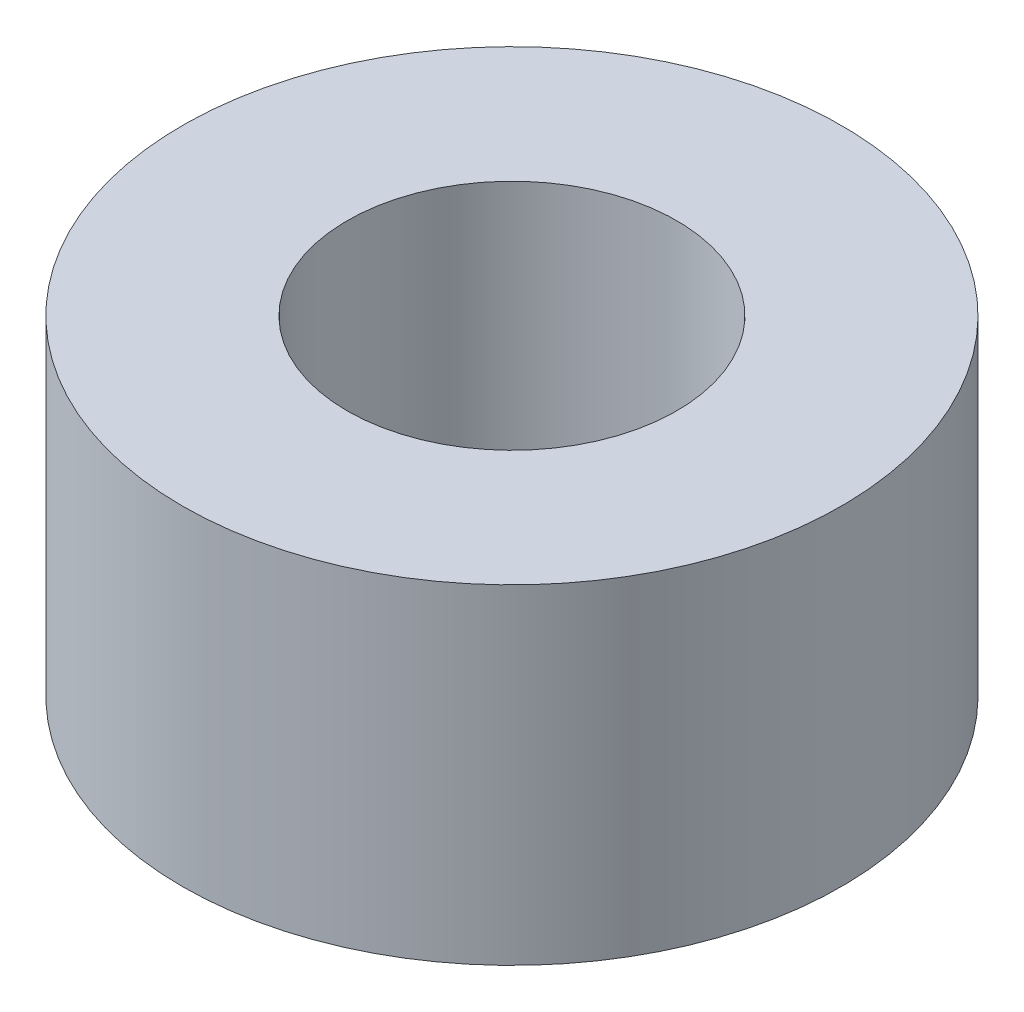
ISO-10303-21;
HEADER;
FILE_DESCRIPTION(('STEP AP214'),'2;1');
FILE_NAME('part.step','',(''),(''),'','','');
FILE_SCHEMA(('AUTOMOTIVE_DESIGN { 1 0 10303 214 1 1 1 1 }'));
ENDSEC;
DATA;
#1=APPLICATION_CONTEXT('core data for automotive mechanical design processes');
#2=APPLICATION_PROTOCOL_DEFINITION('international standard','automotive_design',2000,#1);
#3=PRODUCT_CONTEXT('',#1,'mechanical');
#4=PRODUCT('Part','Part','',(#3));
#5=PRODUCT_RELATED_PRODUCT_CATEGORY('part','',(#4));
#6=PRODUCT_DEFINITION_FORMATION('','',#4);
#7=PRODUCT_DEFINITION_CONTEXT('part definition',#1,'design');
#8=PRODUCT_DEFINITION('design','',#6,#7);
#9=PRODUCT_DEFINITION_SHAPE('','',#8);
#10=(LENGTH_UNIT() NAMED_UNIT(*) SI_UNIT(.MILLI.,.METRE.));
#11=(NAMED_UNIT(*) PLANE_ANGLE_UNIT() SI_UNIT($,.RADIAN.));
#12=(NAMED_UNIT(*) SI_UNIT($,.STERADIAN.) SOLID_ANGLE_UNIT());
#13=UNCERTAINTY_MEASURE_WITH_UNIT(LENGTH_MEASURE(1.E-05),#10,'distance_accuracy_value','');
#14=(GEOMETRIC_REPRESENTATION_CONTEXT(3) GLOBAL_UNCERTAINTY_ASSIGNED_CONTEXT((#13)) GLOBAL_UNIT_ASSIGNED_CONTEXT((#10,
#11,#12)) REPRESENTATION_CONTEXT('',''));
#15=CARTESIAN_POINT('',(0.,0.,0.));
#16=DIRECTION('',(0.,0.,1.));
#17=DIRECTION('',(1.,0.,0.));
#18=AXIS2_PLACEMENT_3D('',#15,#16,#17);
#19=CARTESIAN_POINT('',(0.,3.,0.));
#20=DIRECTION('',(0.,1.,0.));
#21=DIRECTION('',(0.,0.,1.));
#22=AXIS2_PLACEMENT_3D('',#19,#20,#21);
#23=PLANE('',#22);
#24=CARTESIAN_POINT('',(0.,3.,0.));
#25=DIRECTION('',(0.,1.,0.));
#26=DIRECTION('',(0.,0.,1.));
#27=AXIS2_PLACEMENT_3D('',#24,#25,#26);
#28=CIRCLE('',#27,3.);
#29=CARTESIAN_POINT('',(0.,3.,3.));
#30=VERTEX_POINT('',#29);
#31=EDGE_CURVE('E10',#30,#30,#28,.T.);
#32=ORIENTED_EDGE('',*,*,#31,.T.);
#33=EDGE_LOOP('',(#32));
#34=FACE_BOUND('',#33,.T.);
#35=CARTESIAN_POINT('',(0.,3.,0.));
#36=DIRECTION('',(0.,1.,0.));
#37=DIRECTION('',(0.,0.,1.));
#38=AXIS2_PLACEMENT_3D('',#35,#36,#37);
#39=CIRCLE('',#38,1.5);
#40=CARTESIAN_POINT('',(0.,3.,1.5));
#41=VERTEX_POINT('',#40);
#42=EDGE_CURVE('E50',#41,#41,#39,.T.);
#43=ORIENTED_EDGE('',*,*,#42,.F.);
#44=EDGE_LOOP('',(#43));
#45=FACE_BOUND('',#44,.T.);
#46=ADVANCED_FACE('F37',(#34,#45),#23,.T.);
#47=CARTESIAN_POINT('',(0.,0.,0.));
#48=DIRECTION('',(0.,1.,0.));
#49=DIRECTION('',(0.,0.,1.));
#50=AXIS2_PLACEMENT_3D('',#47,#48,#49);
#51=PLANE('',#50);
#52=CARTESIAN_POINT('',(0.,0.,0.));
#53=DIRECTION('',(0.,1.,0.));
#54=DIRECTION('',(0.,0.,1.));
#55=AXIS2_PLACEMENT_3D('',#52,#53,#54);
#56=CIRCLE('',#55,3.);
#57=CARTESIAN_POINT('',(0.,0.,3.));
#58=VERTEX_POINT('',#57);
#59=EDGE_CURVE('E41',#58,#58,#56,.T.);
#60=ORIENTED_EDGE('',*,*,#59,.F.);
#61=EDGE_LOOP('',(#60));
#62=FACE_BOUND('',#61,.T.);
#63=CARTESIAN_POINT('',(0.,0.,0.));
#64=DIRECTION('',(0.,1.,0.));
#65=DIRECTION('',(0.,0.,1.));
#66=AXIS2_PLACEMENT_3D('',#63,#64,#65);
#67=CIRCLE('',#66,1.5);
#68=CARTESIAN_POINT('',(0.,0.,1.5));
#69=VERTEX_POINT('',#68);
#70=EDGE_CURVE('E52',#69,#69,#67,.T.);
#71=ORIENTED_EDGE('',*,*,#70,.T.);
#72=EDGE_LOOP('',(#71));
#73=FACE_BOUND('',#72,.T.);
#74=ADVANCED_FACE('F64',(#62,#73),#51,.F.);
#75=CARTESIAN_POINT('',(0.,3.,0.));
#76=DIRECTION('',(0.,-1.,0.));
#77=DIRECTION('',(0.,0.,-1.));
#78=AXIS2_PLACEMENT_3D('',#75,#76,#77);
#79=CYLINDRICAL_SURFACE('',#78,3.);
#80=ORIENTED_EDGE('',*,*,#31,.F.);
#81=EDGE_LOOP('',(#80));
#82=FACE_BOUND('',#81,.T.);
#83=ORIENTED_EDGE('',*,*,#59,.T.);
#84=EDGE_LOOP('',(#83));
#85=FACE_BOUND('',#84,.T.);
#86=ADVANCED_FACE('F39',(#82,#85),#79,.T.);
#87=CARTESIAN_POINT('',(0.,3.,0.));
#88=DIRECTION('',(0.,-1.,0.));
#89=DIRECTION('',(0.,0.,-1.));
#90=AXIS2_PLACEMENT_3D('',#87,#88,#89);
#91=CYLINDRICAL_SURFACE('',#90,1.5);
#92=ORIENTED_EDGE('',*,*,#42,.T.);
#93=EDGE_LOOP('',(#92));
#94=FACE_BOUND('',#93,.T.);
#95=ORIENTED_EDGE('',*,*,#70,.F.);
#96=EDGE_LOOP('',(#95));
#97=FACE_BOUND('',#96,.T.);
#98=ADVANCED_FACE('F60',(#94,#97),#91,.F.);
#99=CLOSED_SHELL('',(#46,#74,#86,#98));
#100=MANIFOLD_SOLID_BREP('B2',#99);
#101=ADVANCED_BREP_SHAPE_REPRESENTATION('',(#18,#100),#14);
#102=SHAPE_DEFINITION_REPRESENTATION(#9,#101);
ENDSEC;
END-ISO-10303-21;
